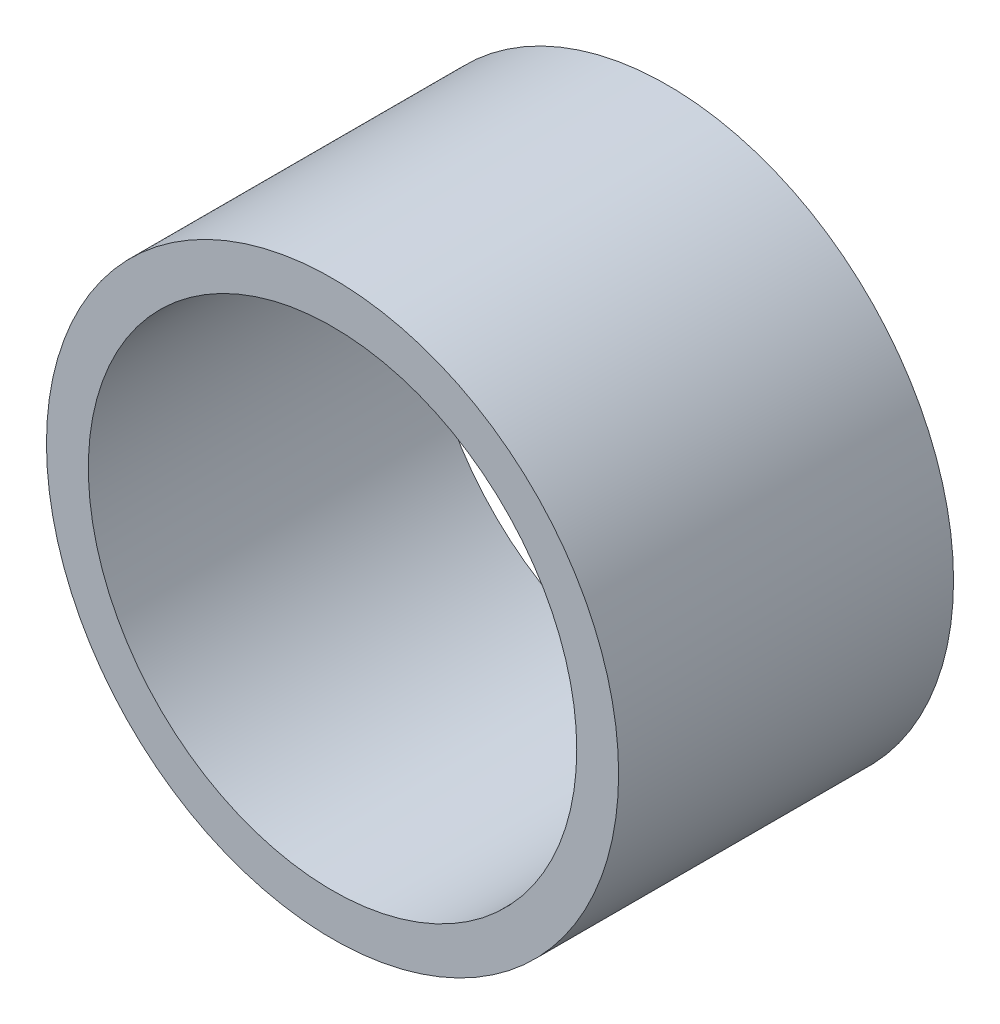
ISO-10303-21;
HEADER;
FILE_DESCRIPTION(('STEP AP214'),'2;1');
FILE_NAME('part.step','',(''),(''),'','','');
FILE_SCHEMA(('AUTOMOTIVE_DESIGN { 1 0 10303 214 1 1 1 1 }'));
ENDSEC;
DATA;
#1=APPLICATION_CONTEXT('core data for automotive mechanical design processes');
#2=APPLICATION_PROTOCOL_DEFINITION('international standard','automotive_design',2000,#1);
#3=PRODUCT_CONTEXT('',#1,'mechanical');
#4=PRODUCT('Part','Part','',(#3));
#5=PRODUCT_RELATED_PRODUCT_CATEGORY('part','',(#4));
#6=PRODUCT_DEFINITION_FORMATION('','',#4);
#7=PRODUCT_DEFINITION_CONTEXT('part definition',#1,'design');
#8=PRODUCT_DEFINITION('design','',#6,#7);
#9=PRODUCT_DEFINITION_SHAPE('','',#8);
#10=(LENGTH_UNIT() NAMED_UNIT(*) SI_UNIT(.MILLI.,.METRE.));
#11=(NAMED_UNIT(*) PLANE_ANGLE_UNIT() SI_UNIT($,.RADIAN.));
#12=(NAMED_UNIT(*) SI_UNIT($,.STERADIAN.) SOLID_ANGLE_UNIT());
#13=UNCERTAINTY_MEASURE_WITH_UNIT(LENGTH_MEASURE(1.E-05),#10,'distance_accuracy_value','');
#14=(GEOMETRIC_REPRESENTATION_CONTEXT(3) GLOBAL_UNCERTAINTY_ASSIGNED_CONTEXT((#13)) GLOBAL_UNIT_ASSIGNED_CONTEXT((#10,
#11,#12)) REPRESENTATION_CONTEXT('',''));
#15=CARTESIAN_POINT('',(0.,0.,0.));
#16=DIRECTION('',(0.,0.,1.));
#17=DIRECTION('',(1.,0.,0.));
#18=AXIS2_PLACEMENT_3D('',#15,#16,#17);
#19=CARTESIAN_POINT('',(0.,0.,24.));
#20=DIRECTION('',(0.,0.,1.));
#21=DIRECTION('',(1.,0.,0.));
#22=AXIS2_PLACEMENT_3D('',#19,#20,#21);
#23=PLANE('',#22);
#24=CARTESIAN_POINT('',(0.,0.,24.));
#25=DIRECTION('',(0.,0.,1.));
#26=DIRECTION('',(1.,0.,0.));
#27=AXIS2_PLACEMENT_3D('',#24,#25,#26);
#28=CIRCLE('',#27,20.5);
#29=CARTESIAN_POINT('',(20.5000000000001,0.,24.));
#30=VERTEX_POINT('',#29);
#31=EDGE_CURVE('E12',#30,#30,#28,.T.);
#32=ORIENTED_EDGE('',*,*,#31,.T.);
#33=EDGE_LOOP('',(#32));
#34=FACE_BOUND('',#33,.T.);
#35=CARTESIAN_POINT('',(0.,0.,24.));
#36=DIRECTION('',(0.,0.,1.));
#37=DIRECTION('',(1.,0.,0.));
#38=AXIS2_PLACEMENT_3D('',#35,#36,#37);
#39=CIRCLE('',#38,17.5);
#40=CARTESIAN_POINT('',(17.5000000000001,0.,24.));
#41=VERTEX_POINT('',#40);
#42=EDGE_CURVE('E53',#41,#41,#39,.T.);
#43=ORIENTED_EDGE('',*,*,#42,.F.);
#44=EDGE_LOOP('',(#43));
#45=FACE_BOUND('',#44,.T.);
#46=ADVANCED_FACE('F42',(#34,#45),#23,.T.);
#47=CARTESIAN_POINT('',(0.,0.,0.));
#48=DIRECTION('',(0.,0.,1.));
#49=DIRECTION('',(1.,0.,0.));
#50=AXIS2_PLACEMENT_3D('',#47,#48,#49);
#51=PLANE('',#50);
#52=CARTESIAN_POINT('',(0.,0.,0.));
#53=DIRECTION('',(0.,0.,1.));
#54=DIRECTION('',(1.,0.,0.));
#55=AXIS2_PLACEMENT_3D('',#52,#53,#54);
#56=CIRCLE('',#55,20.5);
#57=CARTESIAN_POINT('',(20.5000000000001,0.,0.));
#58=VERTEX_POINT('',#57);
#59=EDGE_CURVE('E46',#58,#58,#56,.T.);
#60=ORIENTED_EDGE('',*,*,#59,.F.);
#61=EDGE_LOOP('',(#60));
#62=FACE_BOUND('',#61,.T.);
#63=CARTESIAN_POINT('',(0.,0.,0.));
#64=DIRECTION('',(0.,0.,1.));
#65=DIRECTION('',(1.,0.,0.));
#66=AXIS2_PLACEMENT_3D('',#63,#64,#65);
#67=CIRCLE('',#66,17.5);
#68=CARTESIAN_POINT('',(17.5000000000001,0.,0.));
#69=VERTEX_POINT('',#68);
#70=EDGE_CURVE('E55',#69,#69,#67,.T.);
#71=ORIENTED_EDGE('',*,*,#70,.T.);
#72=EDGE_LOOP('',(#71));
#73=FACE_BOUND('',#72,.T.);
#74=ADVANCED_FACE('F65',(#62,#73),#51,.F.);
#75=CARTESIAN_POINT('',(0.,0.,24.));
#76=DIRECTION('',(0.,0.,-1.));
#77=DIRECTION('',(-1.,0.,0.));
#78=AXIS2_PLACEMENT_3D('',#75,#76,#77);
#79=CYLINDRICAL_SURFACE('',#78,20.5);
#80=ORIENTED_EDGE('',*,*,#31,.F.);
#81=EDGE_LOOP('',(#80));
#82=FACE_BOUND('',#81,.T.);
#83=ORIENTED_EDGE('',*,*,#59,.T.);
#84=EDGE_LOOP('',(#83));
#85=FACE_BOUND('',#84,.T.);
#86=ADVANCED_FACE('F44',(#82,#85),#79,.T.);
#87=CARTESIAN_POINT('',(0.,0.,24.));
#88=DIRECTION('',(0.,0.,-1.));
#89=DIRECTION('',(-1.,0.,0.));
#90=AXIS2_PLACEMENT_3D('',#87,#88,#89);
#91=CYLINDRICAL_SURFACE('',#90,17.5);
#92=ORIENTED_EDGE('',*,*,#42,.T.);
#93=EDGE_LOOP('',(#92));
#94=FACE_BOUND('',#93,.T.);
#95=ORIENTED_EDGE('',*,*,#70,.F.);
#96=EDGE_LOOP('',(#95));
#97=FACE_BOUND('',#96,.T.);
#98=ADVANCED_FACE('F61',(#94,#97),#91,.F.);
#99=CLOSED_SHELL('',(#46,#74,#86,#98));
#100=MANIFOLD_SOLID_BREP('B2',#99);
#101=ADVANCED_BREP_SHAPE_REPRESENTATION('',(#18,#100),#14);
#102=SHAPE_DEFINITION_REPRESENTATION(#9,#101);
ENDSEC;
END-ISO-10303-21;
